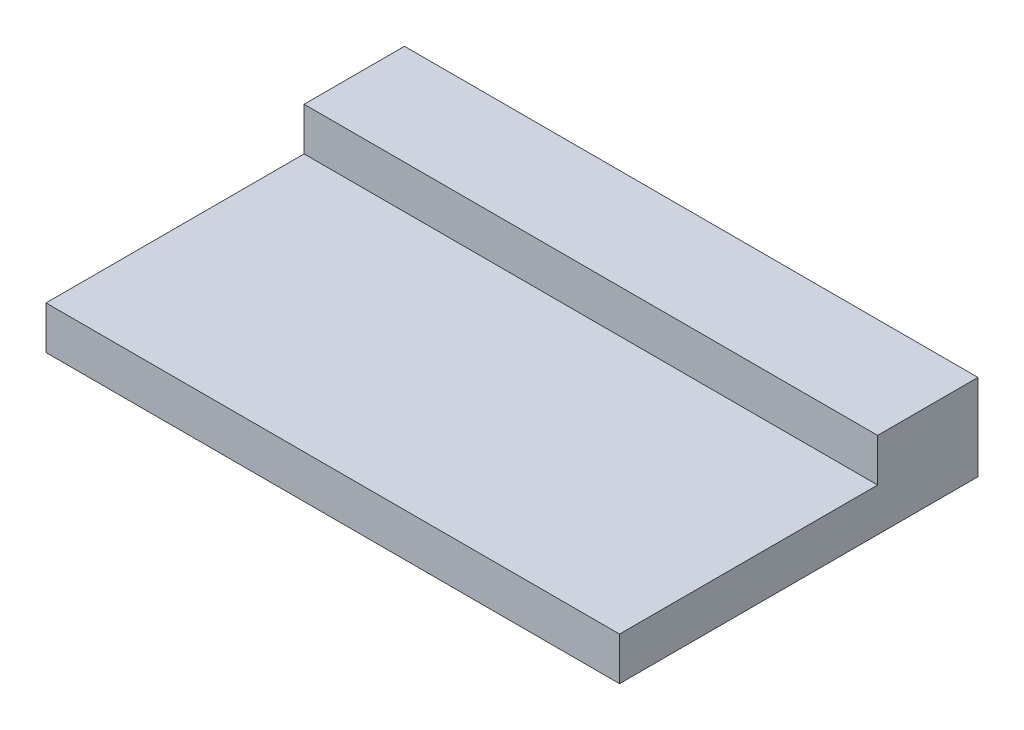
ISO-10303-21;
HEADER;
FILE_DESCRIPTION(('STEP AP214'),'2;1');
FILE_NAME('part.step','',(''),(''),'','','');
FILE_SCHEMA(('AUTOMOTIVE_DESIGN { 1 0 10303 214 1 1 1 1 }'));
ENDSEC;
DATA;
#1=APPLICATION_CONTEXT('core data for automotive mechanical design processes');
#2=APPLICATION_PROTOCOL_DEFINITION('international standard','automotive_design',2000,#1);
#3=PRODUCT_CONTEXT('',#1,'mechanical');
#4=PRODUCT('Part','Part','',(#3));
#5=PRODUCT_RELATED_PRODUCT_CATEGORY('part','',(#4));
#6=PRODUCT_DEFINITION_FORMATION('','',#4);
#7=PRODUCT_DEFINITION_CONTEXT('part definition',#1,'design');
#8=PRODUCT_DEFINITION('design','',#6,#7);
#9=PRODUCT_DEFINITION_SHAPE('','',#8);
#10=(LENGTH_UNIT() NAMED_UNIT(*) SI_UNIT(.MILLI.,.METRE.));
#11=(NAMED_UNIT(*) PLANE_ANGLE_UNIT() SI_UNIT($,.RADIAN.));
#12=(NAMED_UNIT(*) SI_UNIT($,.STERADIAN.) SOLID_ANGLE_UNIT());
#13=UNCERTAINTY_MEASURE_WITH_UNIT(LENGTH_MEASURE(1.E-05),#10,'distance_accuracy_value','');
#14=(GEOMETRIC_REPRESENTATION_CONTEXT(3) GLOBAL_UNCERTAINTY_ASSIGNED_CONTEXT((#13)) GLOBAL_UNIT_ASSIGNED_CONTEXT((#10,
#11,#12)) REPRESENTATION_CONTEXT('',''));
#15=CARTESIAN_POINT('',(0.,0.,0.));
#16=DIRECTION('',(0.,0.,1.));
#17=DIRECTION('',(1.,0.,0.));
#18=AXIS2_PLACEMENT_3D('',#15,#16,#17);
#19=CARTESIAN_POINT('',(0.,3.,-25.));
#20=DIRECTION('',(0.,-1.,0.));
#21=DIRECTION('',(0.,0.,-1.));
#22=AXIS2_PLACEMENT_3D('',#19,#20,#21);
#23=PLANE('',#22);
#24=DIRECTION('',(1.,0.,0.));
#25=VECTOR('',#24,1.);
#26=CARTESIAN_POINT('',(0.,3.,-18.));
#27=LINE('',#26,#25);
#28=CARTESIAN_POINT('',(0.,3.,-18.));
#29=VERTEX_POINT('',#28);
#30=CARTESIAN_POINT('',(40.,3.,-18.));
#31=VERTEX_POINT('',#30);
#32=EDGE_CURVE('E49',#29,#31,#27,.T.);
#33=ORIENTED_EDGE('',*,*,#32,.F.);
#34=DIRECTION('',(0.,0.,1.));
#35=VECTOR('',#34,1.);
#36=CARTESIAN_POINT('',(0.,3.,0.));
#37=LINE('',#36,#35);
#38=CARTESIAN_POINT('',(0.,3.,0.));
#39=VERTEX_POINT('',#38);
#40=EDGE_CURVE('E86',#29,#39,#37,.T.);
#41=ORIENTED_EDGE('',*,*,#40,.T.);
#42=DIRECTION('',(1.,0.,0.));
#43=VECTOR('',#42,1.);
#44=CARTESIAN_POINT('',(0.,3.,0.));
#45=LINE('',#44,#43);
#46=CARTESIAN_POINT('',(40.,3.,0.));
#47=VERTEX_POINT('',#46);
#48=EDGE_CURVE('E55',#39,#47,#45,.T.);
#49=ORIENTED_EDGE('',*,*,#48,.T.);
#50=DIRECTION('',(0.,0.,-1.));
#51=VECTOR('',#50,1.);
#52=CARTESIAN_POINT('',(40.,3.,0.));
#53=LINE('',#52,#51);
#54=EDGE_CURVE('E97',#47,#31,#53,.T.);
#55=ORIENTED_EDGE('',*,*,#54,.T.);
#56=EDGE_LOOP('',(#33,#41,#49,#55));
#57=FACE_BOUND('',#56,.T.);
#58=ADVANCED_FACE('F32',(#57),#23,.F.);
#59=CARTESIAN_POINT('',(0.,3.,0.));
#60=DIRECTION('',(1.,0.,0.));
#61=DIRECTION('',(0.,0.,-1.));
#62=AXIS2_PLACEMENT_3D('',#59,#60,#61);
#63=PLANE('',#62);
#64=DIRECTION('',(0.,0.,1.));
#65=VECTOR('',#64,1.);
#66=CARTESIAN_POINT('',(0.,0.,0.));
#67=LINE('',#66,#65);
#68=CARTESIAN_POINT('',(0.,0.,-25.));
#69=VERTEX_POINT('',#68);
#70=CARTESIAN_POINT('',(0.,0.,0.));
#71=VERTEX_POINT('',#70);
#72=EDGE_CURVE('E93',#69,#71,#67,.T.);
#73=ORIENTED_EDGE('',*,*,#72,.T.);
#74=DIRECTION('',(0.,-1.,0.));
#75=VECTOR('',#74,1.);
#76=CARTESIAN_POINT('',(0.,3.,0.));
#77=LINE('',#76,#75);
#78=EDGE_CURVE('E11',#39,#71,#77,.T.);
#79=ORIENTED_EDGE('',*,*,#78,.F.);
#80=ORIENTED_EDGE('',*,*,#40,.F.);
#81=DIRECTION('',(0.,-1.,0.));
#82=VECTOR('',#81,1.);
#83=CARTESIAN_POINT('',(0.,6.,-18.));
#84=LINE('',#83,#82);
#85=CARTESIAN_POINT('',(0.,6.,-18.));
#86=VERTEX_POINT('',#85);
#87=EDGE_CURVE('E101',#86,#29,#84,.T.);
#88=ORIENTED_EDGE('',*,*,#87,.F.);
#89=DIRECTION('',(0.,0.,1.));
#90=VECTOR('',#89,1.);
#91=CARTESIAN_POINT('',(0.,6.,-25.));
#92=LINE('',#91,#90);
#93=CARTESIAN_POINT('',(0.,6.,-25.));
#94=VERTEX_POINT('',#93);
#95=EDGE_CURVE('E96',#94,#86,#92,.T.);
#96=ORIENTED_EDGE('',*,*,#95,.F.);
#97=DIRECTION('',(0.,-1.,0.));
#98=VECTOR('',#97,1.);
#99=CARTESIAN_POINT('',(0.,3.,-25.));
#100=LINE('',#99,#98);
#101=EDGE_CURVE('E79',#94,#69,#100,.T.);
#102=ORIENTED_EDGE('',*,*,#101,.T.);
#103=EDGE_LOOP('',(#73,#79,#80,#88,#96,#102));
#104=FACE_BOUND('',#103,.T.);
#105=ADVANCED_FACE('F34',(#104),#63,.F.);
#106=CARTESIAN_POINT('',(0.,3.,0.));
#107=DIRECTION('',(0.,0.,-1.));
#108=DIRECTION('',(-1.,0.,0.));
#109=AXIS2_PLACEMENT_3D('',#106,#107,#108);
#110=PLANE('',#109);
#111=DIRECTION('',(1.,0.,0.));
#112=VECTOR('',#111,1.);
#113=CARTESIAN_POINT('',(0.,0.,0.));
#114=LINE('',#113,#112);
#115=CARTESIAN_POINT('',(40.,0.,0.));
#116=VERTEX_POINT('',#115);
#117=EDGE_CURVE('E100',#71,#116,#114,.T.);
#118=ORIENTED_EDGE('',*,*,#117,.T.);
#119=DIRECTION('',(0.,-1.,0.));
#120=VECTOR('',#119,1.);
#121=CARTESIAN_POINT('',(40.,3.,0.));
#122=LINE('',#121,#120);
#123=EDGE_CURVE('E41',#47,#116,#122,.T.);
#124=ORIENTED_EDGE('',*,*,#123,.F.);
#125=ORIENTED_EDGE('',*,*,#48,.F.);
#126=ORIENTED_EDGE('',*,*,#78,.T.);
#127=EDGE_LOOP('',(#118,#124,#125,#126));
#128=FACE_BOUND('',#127,.T.);
#129=ADVANCED_FACE('F148',(#128),#110,.F.);
#130=CARTESIAN_POINT('',(40.,3.,0.));
#131=DIRECTION('',(-1.,0.,0.));
#132=DIRECTION('',(0.,0.,1.));
#133=AXIS2_PLACEMENT_3D('',#130,#131,#132);
#134=PLANE('',#133);
#135=DIRECTION('',(0.,0.,-1.));
#136=VECTOR('',#135,1.);
#137=CARTESIAN_POINT('',(40.,0.,0.));
#138=LINE('',#137,#136);
#139=CARTESIAN_POINT('',(40.,0.,-25.));
#140=VERTEX_POINT('',#139);
#141=EDGE_CURVE('E87',#116,#140,#138,.T.);
#142=ORIENTED_EDGE('',*,*,#141,.T.);
#143=DIRECTION('',(0.,-1.,0.));
#144=VECTOR('',#143,1.);
#145=CARTESIAN_POINT('',(40.,3.,-25.));
#146=LINE('',#145,#144);
#147=CARTESIAN_POINT('',(40.,6.,-25.));
#148=VERTEX_POINT('',#147);
#149=EDGE_CURVE('E82',#148,#140,#146,.T.);
#150=ORIENTED_EDGE('',*,*,#149,.F.);
#151=DIRECTION('',(0.,0.,-1.));
#152=VECTOR('',#151,1.);
#153=CARTESIAN_POINT('',(40.,6.,-25.));
#154=LINE('',#153,#152);
#155=CARTESIAN_POINT('',(40.,6.,-18.));
#156=VERTEX_POINT('',#155);
#157=EDGE_CURVE('E134',#156,#148,#154,.T.);
#158=ORIENTED_EDGE('',*,*,#157,.F.);
#159=DIRECTION('',(0.,-1.,0.));
#160=VECTOR('',#159,1.);
#161=CARTESIAN_POINT('',(40.,6.,-18.));
#162=LINE('',#161,#160);
#163=EDGE_CURVE('E105',#156,#31,#162,.T.);
#164=ORIENTED_EDGE('',*,*,#163,.T.);
#165=ORIENTED_EDGE('',*,*,#54,.F.);
#166=ORIENTED_EDGE('',*,*,#123,.T.);
#167=EDGE_LOOP('',(#142,#150,#158,#164,#165,#166));
#168=FACE_BOUND('',#167,.T.);
#169=ADVANCED_FACE('F132',(#168),#134,.F.);
#170=CARTESIAN_POINT('',(0.,3.,-25.));
#171=DIRECTION('',(0.,0.,1.));
#172=DIRECTION('',(1.,0.,0.));
#173=AXIS2_PLACEMENT_3D('',#170,#171,#172);
#174=PLANE('',#173);
#175=DIRECTION('',(-1.,0.,0.));
#176=VECTOR('',#175,1.);
#177=CARTESIAN_POINT('',(0.,0.,-25.));
#178=LINE('',#177,#176);
#179=EDGE_CURVE('E75',#140,#69,#178,.T.);
#180=ORIENTED_EDGE('',*,*,#179,.T.);
#181=ORIENTED_EDGE('',*,*,#101,.F.);
#182=DIRECTION('',(-1.,0.,0.));
#183=VECTOR('',#182,1.);
#184=CARTESIAN_POINT('',(0.,6.,-25.));
#185=LINE('',#184,#183);
#186=EDGE_CURVE('E135',#148,#94,#185,.T.);
#187=ORIENTED_EDGE('',*,*,#186,.F.);
#188=ORIENTED_EDGE('',*,*,#149,.T.);
#189=EDGE_LOOP('',(#180,#181,#187,#188));
#190=FACE_BOUND('',#189,.T.);
#191=ADVANCED_FACE('F77',(#190),#174,.F.);
#192=CARTESIAN_POINT('',(0.,0.,-25.));
#193=DIRECTION('',(0.,-1.,0.));
#194=DIRECTION('',(0.,0.,-1.));
#195=AXIS2_PLACEMENT_3D('',#192,#193,#194);
#196=PLANE('',#195);
#197=ORIENTED_EDGE('',*,*,#72,.F.);
#198=ORIENTED_EDGE('',*,*,#179,.F.);
#199=ORIENTED_EDGE('',*,*,#141,.F.);
#200=ORIENTED_EDGE('',*,*,#117,.F.);
#201=EDGE_LOOP('',(#197,#198,#199,#200));
#202=FACE_BOUND('',#201,.T.);
#203=ADVANCED_FACE('F99',(#202),#196,.T.);
#204=CARTESIAN_POINT('',(0.,6.,-18.));
#205=DIRECTION('',(0.,0.,-1.));
#206=DIRECTION('',(-1.,0.,0.));
#207=AXIS2_PLACEMENT_3D('',#204,#205,#206);
#208=PLANE('',#207);
#209=ORIENTED_EDGE('',*,*,#32,.T.);
#210=ORIENTED_EDGE('',*,*,#163,.F.);
#211=DIRECTION('',(1.,0.,0.));
#212=VECTOR('',#211,1.);
#213=CARTESIAN_POINT('',(0.,6.,-18.));
#214=LINE('',#213,#212);
#215=EDGE_CURVE('E140',#86,#156,#214,.T.);
#216=ORIENTED_EDGE('',*,*,#215,.F.);
#217=ORIENTED_EDGE('',*,*,#87,.T.);
#218=EDGE_LOOP('',(#209,#210,#216,#217));
#219=FACE_BOUND('',#218,.T.);
#220=ADVANCED_FACE('F128',(#219),#208,.F.);
#221=CARTESIAN_POINT('',(0.,6.,-18.));
#222=DIRECTION('',(0.,1.,0.));
#223=DIRECTION('',(0.,0.,1.));
#224=AXIS2_PLACEMENT_3D('',#221,#222,#223);
#225=PLANE('',#224);
#226=ORIENTED_EDGE('',*,*,#95,.T.);
#227=ORIENTED_EDGE('',*,*,#215,.T.);
#228=ORIENTED_EDGE('',*,*,#157,.T.);
#229=ORIENTED_EDGE('',*,*,#186,.T.);
#230=EDGE_LOOP('',(#226,#227,#228,#229));
#231=FACE_BOUND('',#230,.T.);
#232=ADVANCED_FACE('F145',(#231),#225,.T.);
#233=CLOSED_SHELL('',(#58,#105,#129,#169,#191,#203,#220,#232));
#234=MANIFOLD_SOLID_BREP('B2',#233);
#235=ADVANCED_BREP_SHAPE_REPRESENTATION('',(#18,#234),#14);
#236=SHAPE_DEFINITION_REPRESENTATION(#9,#235);
ENDSEC;
END-ISO-10303-21;
